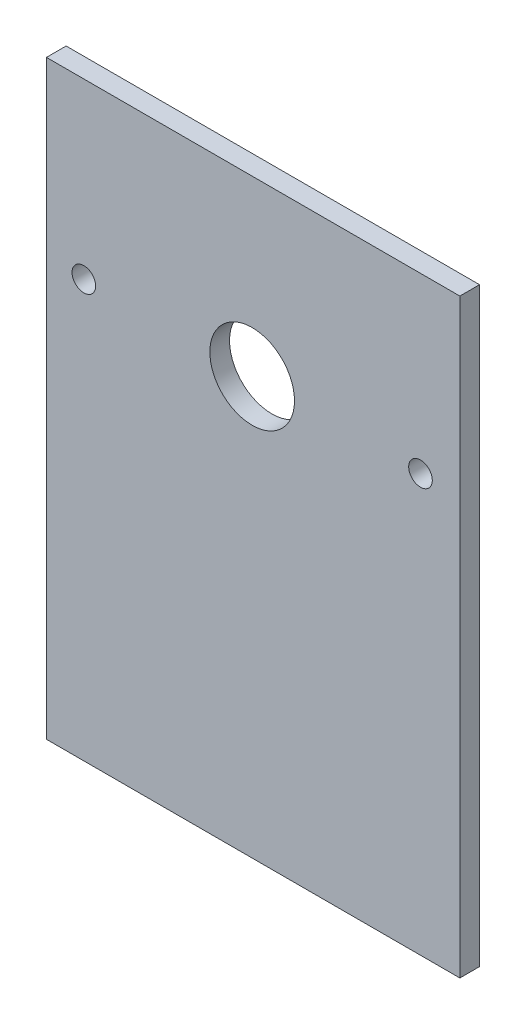
ISO-10303-21;
HEADER;
FILE_DESCRIPTION(('STEP AP214'),'2;1');
FILE_NAME('part.step','',(''),(''),'','','');
FILE_SCHEMA(('AUTOMOTIVE_DESIGN { 1 0 10303 214 1 1 1 1 }'));
ENDSEC;
DATA;
#1=APPLICATION_CONTEXT('core data for automotive mechanical design processes');
#2=APPLICATION_PROTOCOL_DEFINITION('international standard','automotive_design',2000,#1);
#3=PRODUCT_CONTEXT('',#1,'mechanical');
#4=PRODUCT('Part','Part','',(#3));
#5=PRODUCT_RELATED_PRODUCT_CATEGORY('part','',(#4));
#6=PRODUCT_DEFINITION_FORMATION('','',#4);
#7=PRODUCT_DEFINITION_CONTEXT('part definition',#1,'design');
#8=PRODUCT_DEFINITION('design','',#6,#7);
#9=PRODUCT_DEFINITION_SHAPE('','',#8);
#10=(LENGTH_UNIT() NAMED_UNIT(*) SI_UNIT(.MILLI.,.METRE.));
#11=(NAMED_UNIT(*) PLANE_ANGLE_UNIT() SI_UNIT($,.RADIAN.));
#12=(NAMED_UNIT(*) SI_UNIT($,.STERADIAN.) SOLID_ANGLE_UNIT());
#13=UNCERTAINTY_MEASURE_WITH_UNIT(LENGTH_MEASURE(1.E-05),#10,'distance_accuracy_value','');
#14=(GEOMETRIC_REPRESENTATION_CONTEXT(3) GLOBAL_UNCERTAINTY_ASSIGNED_CONTEXT((#13)) GLOBAL_UNIT_ASSIGNED_CONTEXT((#10,
#11,#12)) REPRESENTATION_CONTEXT('',''));
#15=CARTESIAN_POINT('',(0.,0.,0.));
#16=DIRECTION('',(0.,0.,1.));
#17=DIRECTION('',(1.,0.,0.));
#18=AXIS2_PLACEMENT_3D('',#15,#16,#17);
#19=CARTESIAN_POINT('',(0.,0.,5.));
#20=DIRECTION('',(-1.,0.,0.));
#21=DIRECTION('',(0.,-1.,0.));
#22=AXIS2_PLACEMENT_3D('',#19,#20,#21);
#23=PLANE('',#22);
#24=DIRECTION('',(0.,1.,0.));
#25=VECTOR('',#24,1.);
#26=CARTESIAN_POINT('',(0.,0.,0.));
#27=LINE('',#26,#25);
#28=CARTESIAN_POINT('',(0.,-150.,0.));
#29=VERTEX_POINT('',#28);
#30=CARTESIAN_POINT('',(0.,0.,0.));
#31=VERTEX_POINT('',#30);
#32=EDGE_CURVE('E97',#29,#31,#27,.T.);
#33=ORIENTED_EDGE('',*,*,#32,.T.);
#34=DIRECTION('',(0.,0.,-1.));
#35=VECTOR('',#34,1.);
#36=CARTESIAN_POINT('',(0.,0.,5.));
#37=LINE('',#36,#35);
#38=CARTESIAN_POINT('',(0.,0.,5.));
#39=VERTEX_POINT('',#38);
#40=EDGE_CURVE('E11',#39,#31,#37,.T.);
#41=ORIENTED_EDGE('',*,*,#40,.F.);
#42=DIRECTION('',(0.,1.,0.));
#43=VECTOR('',#42,1.);
#44=CARTESIAN_POINT('',(0.,0.,5.));
#45=LINE('',#44,#43);
#46=CARTESIAN_POINT('',(0.,-150.,5.));
#47=VERTEX_POINT('',#46);
#48=EDGE_CURVE('E85',#47,#39,#45,.T.);
#49=ORIENTED_EDGE('',*,*,#48,.F.);
#50=DIRECTION('',(0.,0.,-1.));
#51=VECTOR('',#50,1.);
#52=CARTESIAN_POINT('',(0.,-150.,5.));
#53=LINE('',#52,#51);
#54=EDGE_CURVE('E93',#47,#29,#53,.T.);
#55=ORIENTED_EDGE('',*,*,#54,.T.);
#56=EDGE_LOOP('',(#33,#41,#49,#55));
#57=FACE_BOUND('',#56,.T.);
#58=ADVANCED_FACE('F34',(#57),#23,.F.);
#59=CARTESIAN_POINT('',(0.,0.,5.));
#60=DIRECTION('',(0.,-1.,0.));
#61=DIRECTION('',(0.,0.,-1.));
#62=AXIS2_PLACEMENT_3D('',#59,#60,#61);
#63=PLANE('',#62);
#64=DIRECTION('',(-1.,0.,0.));
#65=VECTOR('',#64,1.);
#66=CARTESIAN_POINT('',(0.,0.,0.));
#67=LINE('',#66,#65);
#68=CARTESIAN_POINT('',(-105.,0.,0.));
#69=VERTEX_POINT('',#68);
#70=EDGE_CURVE('E89',#31,#69,#67,.T.);
#71=ORIENTED_EDGE('',*,*,#70,.T.);
#72=DIRECTION('',(0.,0.,-1.));
#73=VECTOR('',#72,1.);
#74=CARTESIAN_POINT('',(-105.,0.,5.));
#75=LINE('',#74,#73);
#76=CARTESIAN_POINT('',(-105.,0.,5.));
#77=VERTEX_POINT('',#76);
#78=EDGE_CURVE('E42',#77,#69,#75,.T.);
#79=ORIENTED_EDGE('',*,*,#78,.F.);
#80=DIRECTION('',(-1.,0.,0.));
#81=VECTOR('',#80,1.);
#82=CARTESIAN_POINT('',(0.,0.,5.));
#83=LINE('',#82,#81);
#84=EDGE_CURVE('E80',#39,#77,#83,.T.);
#85=ORIENTED_EDGE('',*,*,#84,.F.);
#86=ORIENTED_EDGE('',*,*,#40,.T.);
#87=EDGE_LOOP('',(#71,#79,#85,#86));
#88=FACE_BOUND('',#87,.T.);
#89=ADVANCED_FACE('F88',(#88),#63,.F.);
#90=CARTESIAN_POINT('',(-105.,0.,5.));
#91=DIRECTION('',(1.,0.,0.));
#92=DIRECTION('',(0.,0.,-1.));
#93=AXIS2_PLACEMENT_3D('',#90,#91,#92);
#94=PLANE('',#93);
#95=DIRECTION('',(0.,-1.,0.));
#96=VECTOR('',#95,1.);
#97=CARTESIAN_POINT('',(-105.,0.,0.));
#98=LINE('',#97,#96);
#99=CARTESIAN_POINT('',(-105.,-150.,0.));
#100=VERTEX_POINT('',#99);
#101=EDGE_CURVE('E67',#69,#100,#98,.T.);
#102=ORIENTED_EDGE('',*,*,#101,.T.);
#103=DIRECTION('',(0.,0.,-1.));
#104=VECTOR('',#103,1.);
#105=CARTESIAN_POINT('',(-105.,-150.,5.));
#106=LINE('',#105,#104);
#107=CARTESIAN_POINT('',(-105.,-150.,5.));
#108=VERTEX_POINT('',#107);
#109=EDGE_CURVE('E90',#108,#100,#106,.T.);
#110=ORIENTED_EDGE('',*,*,#109,.F.);
#111=DIRECTION('',(0.,-1.,0.));
#112=VECTOR('',#111,1.);
#113=CARTESIAN_POINT('',(-105.,0.,5.));
#114=LINE('',#113,#112);
#115=EDGE_CURVE('E83',#77,#108,#114,.T.);
#116=ORIENTED_EDGE('',*,*,#115,.F.);
#117=ORIENTED_EDGE('',*,*,#78,.T.);
#118=EDGE_LOOP('',(#102,#110,#116,#117));
#119=FACE_BOUND('',#118,.T.);
#120=ADVANCED_FACE('F91',(#119),#94,.F.);
#121=CARTESIAN_POINT('',(0.,-150.,5.));
#122=DIRECTION('',(0.,1.,0.));
#123=DIRECTION('',(-1.,0.,0.));
#124=AXIS2_PLACEMENT_3D('',#121,#122,#123);
#125=PLANE('',#124);
#126=DIRECTION('',(1.,0.,0.));
#127=VECTOR('',#126,1.);
#128=CARTESIAN_POINT('',(0.,-150.,0.));
#129=LINE('',#128,#127);
#130=EDGE_CURVE('E73',#100,#29,#129,.T.);
#131=ORIENTED_EDGE('',*,*,#130,.T.);
#132=ORIENTED_EDGE('',*,*,#54,.F.);
#133=DIRECTION('',(1.,0.,0.));
#134=VECTOR('',#133,1.);
#135=CARTESIAN_POINT('',(0.,-150.,5.));
#136=LINE('',#135,#134);
#137=EDGE_CURVE('E50',#108,#47,#136,.T.);
#138=ORIENTED_EDGE('',*,*,#137,.F.);
#139=ORIENTED_EDGE('',*,*,#109,.T.);
#140=EDGE_LOOP('',(#131,#132,#138,#139));
#141=FACE_BOUND('',#140,.T.);
#142=ADVANCED_FACE('F105',(#141),#125,.F.);
#143=CARTESIAN_POINT('',(0.,0.,5.));
#144=DIRECTION('',(0.,0.,-1.));
#145=DIRECTION('',(-1.,0.,0.));
#146=AXIS2_PLACEMENT_3D('',#143,#144,#145);
#147=PLANE('',#146);
#148=CARTESIAN_POINT('',(-95.5,-44.05,5.));
#149=DIRECTION('',(0.,0.,1.));
#150=DIRECTION('',(1.,0.,0.));
#151=AXIS2_PLACEMENT_3D('',#148,#149,#150);
#152=CIRCLE('',#151,3.00000000000001);
#153=CARTESIAN_POINT('',(-92.5,-44.05,5.));
#154=VERTEX_POINT('',#153);
#155=EDGE_CURVE('E121',#154,#154,#152,.T.);
#156=ORIENTED_EDGE('',*,*,#155,.F.);
#157=EDGE_LOOP('',(#156));
#158=FACE_BOUND('',#157,.T.);
#159=CARTESIAN_POINT('',(-9.99999999999998,-44.05,5.));
#160=DIRECTION('',(0.,0.,1.));
#161=DIRECTION('',(1.,0.,0.));
#162=AXIS2_PLACEMENT_3D('',#159,#160,#161);
#163=CIRCLE('',#162,3.);
#164=CARTESIAN_POINT('',(-6.99999999999998,-44.05,5.));
#165=VERTEX_POINT('',#164);
#166=EDGE_CURVE('E120',#165,#165,#163,.T.);
#167=ORIENTED_EDGE('',*,*,#166,.F.);
#168=EDGE_LOOP('',(#167));
#169=FACE_BOUND('',#168,.T.);
#170=CARTESIAN_POINT('',(-52.75,-44.05,5.));
#171=DIRECTION('',(0.,0.,1.));
#172=DIRECTION('',(1.,0.,0.));
#173=AXIS2_PLACEMENT_3D('',#170,#171,#172);
#174=CIRCLE('',#173,10.75);
#175=CARTESIAN_POINT('',(-42.,-44.05,5.));
#176=VERTEX_POINT('',#175);
#177=EDGE_CURVE('E113',#176,#176,#174,.T.);
#178=ORIENTED_EDGE('',*,*,#177,.F.);
#179=EDGE_LOOP('',(#178));
#180=FACE_BOUND('',#179,.T.);
#181=ORIENTED_EDGE('',*,*,#48,.T.);
#182=ORIENTED_EDGE('',*,*,#84,.T.);
#183=ORIENTED_EDGE('',*,*,#115,.T.);
#184=ORIENTED_EDGE('',*,*,#137,.T.);
#185=EDGE_LOOP('',(#181,#182,#183,#184));
#186=FACE_BOUND('',#185,.T.);
#187=ADVANCED_FACE('F81',(#158,#169,#180,#186),#147,.F.);
#188=CARTESIAN_POINT('',(0.,0.,0.));
#189=DIRECTION('',(0.,0.,-1.));
#190=DIRECTION('',(-1.,0.,0.));
#191=AXIS2_PLACEMENT_3D('',#188,#189,#190);
#192=PLANE('',#191);
#193=CARTESIAN_POINT('',(-95.5,-44.05,0.));
#194=DIRECTION('',(0.,0.,-1.));
#195=DIRECTION('',(-1.,0.,0.));
#196=AXIS2_PLACEMENT_3D('',#193,#194,#195);
#197=CIRCLE('',#196,3.00000000000001);
#198=CARTESIAN_POINT('',(-98.5,-44.05,0.));
#199=VERTEX_POINT('',#198);
#200=EDGE_CURVE('E117',#199,#199,#197,.F.);
#201=ORIENTED_EDGE('',*,*,#200,.T.);
#202=EDGE_LOOP('',(#201));
#203=FACE_BOUND('',#202,.T.);
#204=CARTESIAN_POINT('',(-9.99999999999998,-44.05,0.));
#205=DIRECTION('',(0.,0.,-1.));
#206=DIRECTION('',(-1.,0.,0.));
#207=AXIS2_PLACEMENT_3D('',#204,#205,#206);
#208=CIRCLE('',#207,3.);
#209=CARTESIAN_POINT('',(-13.,-44.05,0.));
#210=VERTEX_POINT('',#209);
#211=EDGE_CURVE('E116',#210,#210,#208,.F.);
#212=ORIENTED_EDGE('',*,*,#211,.T.);
#213=EDGE_LOOP('',(#212));
#214=FACE_BOUND('',#213,.T.);
#215=CARTESIAN_POINT('',(-52.75,-44.05,0.));
#216=DIRECTION('',(0.,0.,-1.));
#217=DIRECTION('',(-1.,0.,0.));
#218=AXIS2_PLACEMENT_3D('',#215,#216,#217);
#219=CIRCLE('',#218,10.75);
#220=CARTESIAN_POINT('',(-63.5,-44.05,0.));
#221=VERTEX_POINT('',#220);
#222=EDGE_CURVE('E100',#221,#221,#219,.F.);
#223=ORIENTED_EDGE('',*,*,#222,.T.);
#224=EDGE_LOOP('',(#223));
#225=FACE_BOUND('',#224,.T.);
#226=ORIENTED_EDGE('',*,*,#32,.F.);
#227=ORIENTED_EDGE('',*,*,#130,.F.);
#228=ORIENTED_EDGE('',*,*,#101,.F.);
#229=ORIENTED_EDGE('',*,*,#70,.F.);
#230=EDGE_LOOP('',(#226,#227,#228,#229));
#231=FACE_BOUND('',#230,.T.);
#232=ADVANCED_FACE('F108',(#203,#214,#225,#231),#192,.T.);
#233=CARTESIAN_POINT('',(-52.75,-44.05,-30.4055915910215));
#234=DIRECTION('',(0.,0.,1.));
#235=DIRECTION('',(1.,0.,0.));
#236=AXIS2_PLACEMENT_3D('',#233,#234,#235);
#237=CYLINDRICAL_SURFACE('',#236,10.75);
#238=ORIENTED_EDGE('',*,*,#177,.T.);
#239=EDGE_LOOP('',(#238));
#240=FACE_BOUND('',#239,.T.);
#241=ORIENTED_EDGE('',*,*,#222,.F.);
#242=EDGE_LOOP('',(#241));
#243=FACE_BOUND('',#242,.T.);
#244=ADVANCED_FACE('F138',(#240,#243),#237,.F.);
#245=CARTESIAN_POINT('',(-9.99999999999998,-44.05,-30.4055915910215));
#246=DIRECTION('',(0.,0.,1.));
#247=DIRECTION('',(1.,0.,0.));
#248=AXIS2_PLACEMENT_3D('',#245,#246,#247);
#249=CYLINDRICAL_SURFACE('',#248,3.);
#250=ORIENTED_EDGE('',*,*,#166,.T.);
#251=EDGE_LOOP('',(#250));
#252=FACE_BOUND('',#251,.T.);
#253=ORIENTED_EDGE('',*,*,#211,.F.);
#254=EDGE_LOOP('',(#253));
#255=FACE_BOUND('',#254,.T.);
#256=ADVANCED_FACE('F129',(#252,#255),#249,.F.);
#257=CARTESIAN_POINT('',(-95.5,-44.05,-30.4055915910215));
#258=DIRECTION('',(0.,0.,1.));
#259=DIRECTION('',(1.,0.,0.));
#260=AXIS2_PLACEMENT_3D('',#257,#258,#259);
#261=CYLINDRICAL_SURFACE('',#260,3.00000000000001);
#262=ORIENTED_EDGE('',*,*,#155,.T.);
#263=EDGE_LOOP('',(#262));
#264=FACE_BOUND('',#263,.T.);
#265=ORIENTED_EDGE('',*,*,#200,.F.);
#266=EDGE_LOOP('',(#265));
#267=FACE_BOUND('',#266,.T.);
#268=ADVANCED_FACE('F184',(#264,#267),#261,.F.);
#269=CLOSED_SHELL('',(#58,#89,#120,#142,#187,#232,#244,#256,#268));
#270=MANIFOLD_SOLID_BREP('B2',#269);
#271=ADVANCED_BREP_SHAPE_REPRESENTATION('',(#18,#270),#14);
#272=SHAPE_DEFINITION_REPRESENTATION(#9,#271);
ENDSEC;
END-ISO-10303-21;
